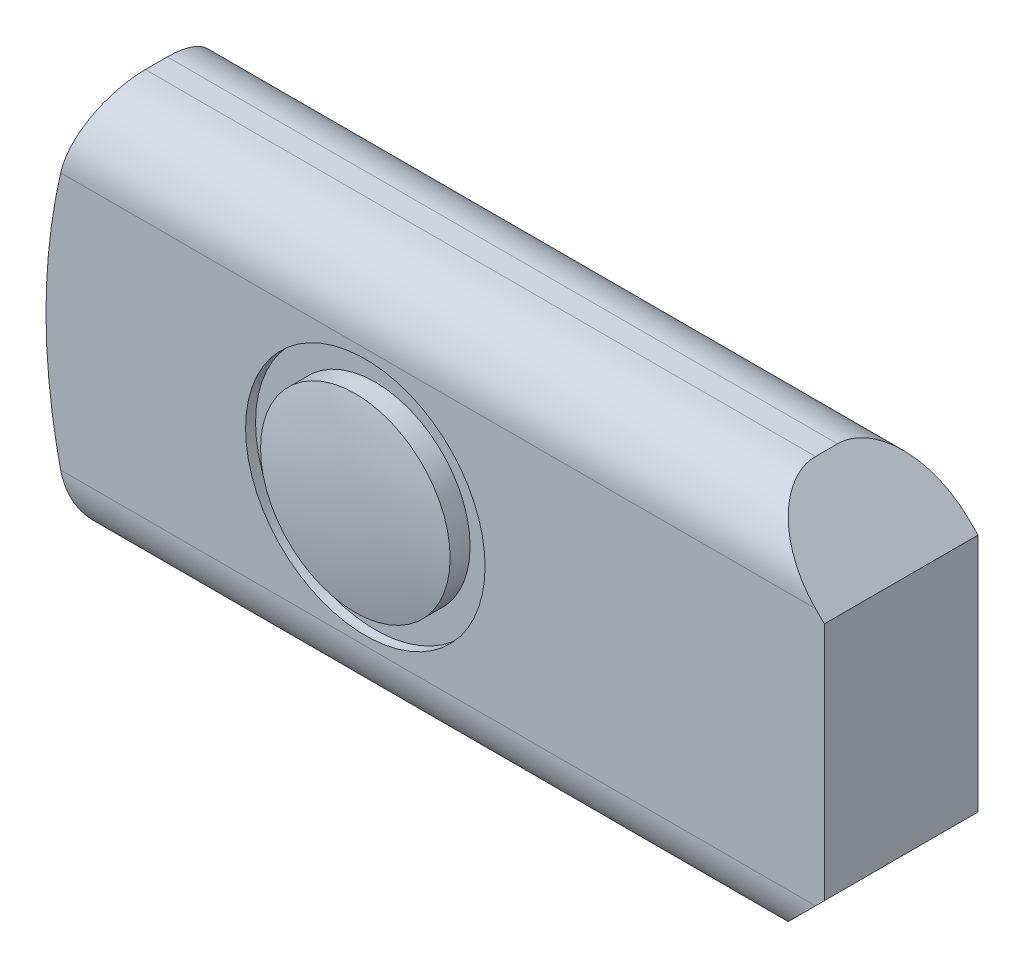
ISO-10303-21;
HEADER;
FILE_DESCRIPTION(('STEP AP214'),'2;1');
FILE_NAME('part.step','',(''),(''),'','','');
FILE_SCHEMA(('AUTOMOTIVE_DESIGN { 1 0 10303 214 1 1 1 1 }'));
ENDSEC;
DATA;
#1=APPLICATION_CONTEXT('core data for automotive mechanical design processes');
#2=APPLICATION_PROTOCOL_DEFINITION('international standard','automotive_design',2000,#1);
#3=PRODUCT_CONTEXT('',#1,'mechanical');
#4=PRODUCT('Part','Part','',(#3));
#5=PRODUCT_RELATED_PRODUCT_CATEGORY('part','',(#4));
#6=PRODUCT_DEFINITION_FORMATION('','',#4);
#7=PRODUCT_DEFINITION_CONTEXT('part definition',#1,'design');
#8=PRODUCT_DEFINITION('design','',#6,#7);
#9=PRODUCT_DEFINITION_SHAPE('','',#8);
#10=(LENGTH_UNIT() NAMED_UNIT(*) SI_UNIT(.MILLI.,.METRE.));
#11=(NAMED_UNIT(*) PLANE_ANGLE_UNIT() SI_UNIT($,.RADIAN.));
#12=(NAMED_UNIT(*) SI_UNIT($,.STERADIAN.) SOLID_ANGLE_UNIT());
#13=UNCERTAINTY_MEASURE_WITH_UNIT(LENGTH_MEASURE(1.E-05),#10,'distance_accuracy_value','');
#14=(GEOMETRIC_REPRESENTATION_CONTEXT(3) GLOBAL_UNCERTAINTY_ASSIGNED_CONTEXT((#13)) GLOBAL_UNIT_ASSIGNED_CONTEXT((#10,
#11,#12)) REPRESENTATION_CONTEXT('',''));
#15=CARTESIAN_POINT('',(0.,0.,0.));
#16=DIRECTION('',(0.,0.,1.));
#17=DIRECTION('',(1.,0.,0.));
#18=AXIS2_PLACEMENT_3D('',#15,#16,#17);
#19=CARTESIAN_POINT('',(1.67860547889594,0.,7.7));
#20=DIRECTION('',(0.,1.,0.));
#21=DIRECTION('',(0.,0.,1.));
#22=AXIS2_PLACEMENT_3D('',#19,#20,#21);
#23=PLANE('',#22);
#24=DIRECTION('',(0.,0.,-1.));
#25=VECTOR('',#24,1.);
#26=CARTESIAN_POINT('',(35.2581686598632,0.,14.5));
#27=LINE('',#26,#25);
#28=CARTESIAN_POINT('',(35.2581686598632,0.,4.4));
#29=VERTEX_POINT('',#28);
#30=CARTESIAN_POINT('',(35.2581686598632,0.,3.3));
#31=VERTEX_POINT('',#30);
#32=EDGE_CURVE('E61',#29,#31,#27,.T.);
#33=ORIENTED_EDGE('',*,*,#32,.F.);
#34=DIRECTION('',(1.,0.,0.));
#35=VECTOR('',#34,1.);
#36=CARTESIAN_POINT('',(1.67860547889594,0.,4.4));
#37=LINE('',#36,#35);
#38=CARTESIAN_POINT('',(1.67860547889594,0.,4.4));
#39=VERTEX_POINT('',#38);
#40=EDGE_CURVE('E200',#29,#39,#37,.F.);
#41=ORIENTED_EDGE('',*,*,#40,.T.);
#42=DIRECTION('',(0.,0.,-1.));
#43=VECTOR('',#42,1.);
#44=CARTESIAN_POINT('',(1.67860547889594,0.,7.7));
#45=LINE('',#44,#43);
#46=CARTESIAN_POINT('',(1.67860547889594,0.,3.3));
#47=VERTEX_POINT('',#46);
#48=EDGE_CURVE('E185',#39,#47,#45,.T.);
#49=ORIENTED_EDGE('',*,*,#48,.T.);
#50=DIRECTION('',(1.,0.,0.));
#51=VECTOR('',#50,1.);
#52=CARTESIAN_POINT('',(39.,0.,3.3));
#53=LINE('',#52,#51);
#54=EDGE_CURVE('E196',#47,#31,#53,.T.);
#55=ORIENTED_EDGE('',*,*,#54,.T.);
#56=EDGE_LOOP('',(#33,#41,#49,#55));
#57=FACE_BOUND('',#56,.T.);
#58=ADVANCED_FACE('F40',(#57),#23,.F.);
#59=CARTESIAN_POINT('',(39.,0.,7.7));
#60=DIRECTION('',(-1.,0.,0.));
#61=DIRECTION('',(0.,-1.,0.));
#62=AXIS2_PLACEMENT_3D('',#59,#60,#61);
#63=PLANE('',#62);
#64=DIRECTION('',(0.,0.,-1.));
#65=VECTOR('',#64,1.);
#66=CARTESIAN_POINT('',(39.,15.7581686598632,14.5));
#67=LINE('',#66,#65);
#68=CARTESIAN_POINT('',(39.,15.7581686598632,7.7));
#69=VERTEX_POINT('',#68);
#70=CARTESIAN_POINT('',(39.,15.7581686598632,0.));
#71=VERTEX_POINT('',#70);
#72=EDGE_CURVE('E137',#69,#71,#67,.T.);
#73=ORIENTED_EDGE('',*,*,#72,.F.);
#74=DIRECTION('',(0.,1.,0.));
#75=VECTOR('',#74,1.);
#76=CARTESIAN_POINT('',(39.,0.,7.7));
#77=LINE('',#76,#75);
#78=CARTESIAN_POINT('',(39.,3.74183134013686,7.7));
#79=VERTEX_POINT('',#78);
#80=EDGE_CURVE('E172',#79,#69,#77,.T.);
#81=ORIENTED_EDGE('',*,*,#80,.F.);
#82=DIRECTION('',(0.,0.,-1.));
#83=VECTOR('',#82,1.);
#84=CARTESIAN_POINT('',(39.,3.74183134013686,14.5));
#85=LINE('',#84,#83);
#86=CARTESIAN_POINT('',(39.,3.74183134013686,0.));
#87=VERTEX_POINT('',#86);
#88=EDGE_CURVE('E149',#79,#87,#85,.T.);
#89=ORIENTED_EDGE('',*,*,#88,.T.);
#90=DIRECTION('',(0.,1.,0.));
#91=VECTOR('',#90,1.);
#92=CARTESIAN_POINT('',(39.,0.,0.));
#93=LINE('',#92,#91);
#94=EDGE_CURVE('E156',#87,#71,#93,.T.);
#95=ORIENTED_EDGE('',*,*,#94,.T.);
#96=EDGE_LOOP('',(#73,#81,#89,#95));
#97=FACE_BOUND('',#96,.T.);
#98=ADVANCED_FACE('F164',(#97),#63,.F.);
#99=CARTESIAN_POINT('',(1.67860547889594,19.5,7.7));
#100=DIRECTION('',(0.,1.,0.));
#101=DIRECTION('',(0.,0.,1.));
#102=AXIS2_PLACEMENT_3D('',#99,#100,#101);
#103=PLANE('',#102);
#104=DIRECTION('',(1.,0.,0.));
#105=VECTOR('',#104,1.);
#106=CARTESIAN_POINT('',(39.,19.5,4.4));
#107=LINE('',#106,#105);
#108=CARTESIAN_POINT('',(1.67860547889594,19.5,4.4));
#109=VERTEX_POINT('',#108);
#110=CARTESIAN_POINT('',(35.2581686598632,19.5,4.4));
#111=VERTEX_POINT('',#110);
#112=EDGE_CURVE('E346',#109,#111,#107,.T.);
#113=ORIENTED_EDGE('',*,*,#112,.T.);
#114=DIRECTION('',(0.,0.,-1.));
#115=VECTOR('',#114,1.);
#116=CARTESIAN_POINT('',(35.2581686598632,19.5,14.5));
#117=LINE('',#116,#115);
#118=CARTESIAN_POINT('',(35.2581686598632,19.5,3.3));
#119=VERTEX_POINT('',#118);
#120=EDGE_CURVE('E71',#111,#119,#117,.T.);
#121=ORIENTED_EDGE('',*,*,#120,.T.);
#122=DIRECTION('',(1.,0.,0.));
#123=VECTOR('',#122,1.);
#124=CARTESIAN_POINT('',(1.67860547889594,19.5,3.3));
#125=LINE('',#124,#123);
#126=CARTESIAN_POINT('',(1.67860547889594,19.5,3.3));
#127=VERTEX_POINT('',#126);
#128=EDGE_CURVE('E349',#119,#127,#125,.F.);
#129=ORIENTED_EDGE('',*,*,#128,.T.);
#130=DIRECTION('',(0.,0.,-1.));
#131=VECTOR('',#130,1.);
#132=CARTESIAN_POINT('',(1.67860547889594,19.5,7.7));
#133=LINE('',#132,#131);
#134=EDGE_CURVE('E181',#109,#127,#133,.T.);
#135=ORIENTED_EDGE('',*,*,#134,.F.);
#136=EDGE_LOOP('',(#113,#121,#129,#135));
#137=FACE_BOUND('',#136,.T.);
#138=ADVANCED_FACE('F309',(#137),#103,.T.);
#139=CARTESIAN_POINT('',(0.,9.75,7.7));
#140=DIRECTION('',(0.,0.,-1.));
#141=DIRECTION('',(-1.,0.,0.));
#142=AXIS2_PLACEMENT_3D('',#139,#140,#141);
#143=PLANE('',#142);
#144=CARTESIAN_POINT('',(16.,9.75000000000001,7.7));
#145=DIRECTION('',(0.,0.,1.));
#146=DIRECTION('',(1.,0.,0.));
#147=AXIS2_PLACEMENT_3D('',#144,#145,#146);
#148=CIRCLE('',#147,6.);
#149=CARTESIAN_POINT('',(22.,9.75000000000001,7.7));
#150=VERTEX_POINT('',#149);
#151=EDGE_CURVE('E280',#150,#150,#148,.T.);
#152=ORIENTED_EDGE('',*,*,#151,.F.);
#153=EDGE_LOOP('',(#152));
#154=FACE_BOUND('',#153,.T.);
#155=DIRECTION('',(0.707106781186549,-0.707106781186546,0.));
#156=VECTOR('',#155,1.);
#157=CARTESIAN_POINT('',(22.5040843299315,32.2540843299316,7.7));
#158=LINE('',#157,#156);
#159=CARTESIAN_POINT('',(38.5581686598632,16.2,7.7));
#160=VERTEX_POINT('',#159);
#161=EDGE_CURVE('E143',#160,#69,#158,.T.);
#162=ORIENTED_EDGE('',*,*,#161,.F.);
#163=DIRECTION('',(1.,0.,0.));
#164=VECTOR('',#163,1.);
#165=CARTESIAN_POINT('',(1.67860547889594,16.2,7.7));
#166=LINE('',#165,#164);
#167=CARTESIAN_POINT('',(0.734613379994931,16.2,7.7));
#168=VERTEX_POINT('',#167);
#169=EDGE_CURVE('E189',#160,#168,#166,.F.);
#170=ORIENTED_EDGE('',*,*,#169,.T.);
#171=CARTESIAN_POINT('',(1.67860547889594,19.5,7.7));
#172=CARTESIAN_POINT('',(-1.67860547889594,9.75,7.7));
#173=CARTESIAN_POINT('',(1.67860547889594,0.,7.7));
#174=B_SPLINE_CURVE_WITH_KNOTS('',2,(#171,#172,#173),.UNSPECIFIED.,.F.,.F.,(3,3),(0.,1.),.UNSPECIFIED.);
#175=CARTESIAN_POINT('',(0.734613379994932,3.3,7.7));
#176=VERTEX_POINT('',#175);
#177=EDGE_CURVE('E166',#168,#176,#174,.T.);
#178=ORIENTED_EDGE('',*,*,#177,.T.);
#179=DIRECTION('',(1.,0.,0.));
#180=VECTOR('',#179,1.);
#181=CARTESIAN_POINT('',(0.,3.3,7.7));
#182=LINE('',#181,#180);
#183=CARTESIAN_POINT('',(38.5581686598631,3.3,7.7));
#184=VERTEX_POINT('',#183);
#185=EDGE_CURVE('E192',#176,#184,#182,.T.);
#186=ORIENTED_EDGE('',*,*,#185,.T.);
#187=DIRECTION('',(-0.707106781186546,-0.707106781186549,0.));
#188=VECTOR('',#187,1.);
#189=CARTESIAN_POINT('',(22.5040843299317,-12.7540843299316,7.7));
#190=LINE('',#189,#188);
#191=EDGE_CURVE('E175',#79,#184,#190,.T.);
#192=ORIENTED_EDGE('',*,*,#191,.F.);
#193=ORIENTED_EDGE('',*,*,#80,.T.);
#194=EDGE_LOOP('',(#162,#170,#178,#186,#192,#193));
#195=FACE_BOUND('',#194,.T.);
#196=ADVANCED_FACE('F243',(#154,#195),#143,.F.);
#197=CARTESIAN_POINT('',(0.,9.75,0.));
#198=DIRECTION('',(0.,0.,-1.));
#199=DIRECTION('',(-1.,0.,0.));
#200=AXIS2_PLACEMENT_3D('',#197,#198,#199);
#201=PLANE('',#200);
#202=CARTESIAN_POINT('',(16.,9.75000000000001,0.));
#203=DIRECTION('',(0.,0.,-1.));
#204=DIRECTION('',(-1.,0.,0.));
#205=AXIS2_PLACEMENT_3D('',#202,#203,#204);
#206=CIRCLE('',#205,6.);
#207=CARTESIAN_POINT('',(10.,9.75000000000001,0.));
#208=VERTEX_POINT('',#207);
#209=EDGE_CURVE('E266',#208,#208,#206,.T.);
#210=ORIENTED_EDGE('',*,*,#209,.F.);
#211=EDGE_LOOP('',(#210));
#212=FACE_BOUND('',#211,.T.);
#213=DIRECTION('',(1.,0.,0.));
#214=VECTOR('',#213,1.);
#215=CARTESIAN_POINT('',(0.,16.2,0.));
#216=LINE('',#215,#214);
#217=CARTESIAN_POINT('',(0.734613379994931,16.2,0.));
#218=VERTEX_POINT('',#217);
#219=CARTESIAN_POINT('',(38.5581686598632,16.2,0.));
#220=VERTEX_POINT('',#219);
#221=EDGE_CURVE('E159',#218,#220,#216,.T.);
#222=ORIENTED_EDGE('',*,*,#221,.T.);
#223=DIRECTION('',(0.707106781186549,-0.707106781186546,0.));
#224=VECTOR('',#223,1.);
#225=CARTESIAN_POINT('',(35.2581686598632,19.5,0.));
#226=LINE('',#225,#224);
#227=EDGE_CURVE('E140',#220,#71,#226,.T.);
#228=ORIENTED_EDGE('',*,*,#227,.T.);
#229=ORIENTED_EDGE('',*,*,#94,.F.);
#230=DIRECTION('',(-0.707106781186546,-0.707106781186549,0.));
#231=VECTOR('',#230,1.);
#232=CARTESIAN_POINT('',(39.,3.74183134013686,0.));
#233=LINE('',#232,#231);
#234=CARTESIAN_POINT('',(38.5581686598631,3.3,0.));
#235=VERTEX_POINT('',#234);
#236=EDGE_CURVE('E161',#87,#235,#233,.T.);
#237=ORIENTED_EDGE('',*,*,#236,.T.);
#238=DIRECTION('',(1.,0.,0.));
#239=VECTOR('',#238,1.);
#240=CARTESIAN_POINT('',(1.67860547889594,3.3,0.));
#241=LINE('',#240,#239);
#242=CARTESIAN_POINT('',(0.734613379994932,3.3,0.));
#243=VERTEX_POINT('',#242);
#244=EDGE_CURVE('E334',#235,#243,#241,.F.);
#245=ORIENTED_EDGE('',*,*,#244,.T.);
#246=CARTESIAN_POINT('',(1.67860547889594,19.5,0.));
#247=CARTESIAN_POINT('',(-1.67860547889594,9.75,0.));
#248=CARTESIAN_POINT('',(1.67860547889594,0.,0.));
#249=B_SPLINE_CURVE_WITH_KNOTS('',2,(#246,#247,#248),.UNSPECIFIED.,.F.,.F.,(3,3),(0.,1.),.UNSPECIFIED.);
#250=EDGE_CURVE('E167',#218,#243,#249,.T.);
#251=ORIENTED_EDGE('',*,*,#250,.F.);
#252=EDGE_LOOP('',(#222,#228,#229,#237,#245,#251));
#253=FACE_BOUND('',#252,.T.);
#254=ADVANCED_FACE('F154',(#212,#253),#201,.T.);
#255=CARTESIAN_POINT('',(0.,3.3,4.4));
#256=DIRECTION('',(1.,0.,0.));
#257=DIRECTION('',(0.,0.,-1.));
#258=AXIS2_PLACEMENT_3D('',#255,#256,#257);
#259=CYLINDRICAL_SURFACE('',#258,3.3);
#260=ORIENTED_EDGE('',*,*,#40,.F.);
#261=CARTESIAN_POINT('',(38.5581686598631,3.3,4.4));
#262=DIRECTION('',(0.707106781186549,-0.707106781186546,0.));
#263=DIRECTION('',(0.707106781186546,0.707106781186549,0.));
#264=AXIS2_PLACEMENT_3D('',#261,#262,#263);
#265=ELLIPSE('',#264,4.6669047558312,3.3);
#266=EDGE_CURVE('E248',#29,#184,#265,.F.);
#267=ORIENTED_EDGE('',*,*,#266,.T.);
#268=ORIENTED_EDGE('',*,*,#185,.F.);
#269=CARTESIAN_POINT('',(1.67860547889594,0.,4.4));
#270=CARTESIAN_POINT('',(1.67861236601289,-1.15102089664836E-05,4.4894932366842));
#271=CARTESIAN_POINT('',(1.67735210220116,0.00364026636792465,4.57898007595627));
#272=CARTESIAN_POINT('',(1.67234916106663,0.0181815712053499,4.7572773911837));
#273=CARTESIAN_POINT('',(1.66860695464756,0.0290697264946491,4.84608799221056));
#274=CARTESIAN_POINT('',(1.65870429294161,0.0579591086030109,5.02218474745448));
#275=CARTESIAN_POINT('',(1.65254986687802,0.0759426017145863,5.10947414005887));
#276=CARTESIAN_POINT('',(1.63792784297862,0.118836650802228,5.28211223095235));
#277=CARTESIAN_POINT('',(1.62946020714328,0.143747320572472,5.36746089733581));
#278=CARTESIAN_POINT('',(1.60077282744498,0.228553953225657,5.61967109087148));
#279=CARTESIAN_POINT('',(1.57725724490851,0.298557071076664,5.78289268290071));
#280=CARTESIAN_POINT('',(1.52281921618734,0.463086389529341,6.09502755105877));
#281=CARTESIAN_POINT('',(1.49189414271615,0.557621289697131,6.24393572557771));
#282=CARTESIAN_POINT('',(1.4233434614512,0.771234356283792,6.52784708892374));
#283=CARTESIAN_POINT('',(1.38555881002807,0.890908878144648,6.6623633454669));
#284=CARTESIAN_POINT('',(1.30576447196083,1.14973475427622,6.90966657160935));
#285=CARTESIAN_POINT('',(1.2637533862542,1.2888925640456,7.02244630957992));
#286=CARTESIAN_POINT('',(1.17529166603767,1.59018038119677,7.22867977236811));
#287=CARTESIAN_POINT('',(1.12872461873099,1.75309505235175,7.32093775157351));
#288=CARTESIAN_POINT('',(1.03504441405473,2.0919887944317,7.47659815908762));
#289=CARTESIAN_POINT('',(0.987931438640736,2.26796361247543,7.54000993328038));
#290=CARTESIAN_POINT('',(0.905752198212071,2.58665166619664,7.62516742652092));
#291=CARTESIAN_POINT('',(0.870416604655798,2.72766077422131,7.65315360874093));
#292=CARTESIAN_POINT('',(0.801236416115859,3.01234145643979,7.69057650244598));
#293=CARTESIAN_POINT('',(0.767390545534148,3.15601059702922,7.70002939776564));
#294=CARTESIAN_POINT('',(0.734613379994932,3.3,7.7));
#295=B_SPLINE_CURVE_WITH_KNOTS('',3,(#269,#270,#271,#272,#273,#274,#275,#276,#277,#278,#279,
#280,#281,#282,#283,#284,#285,#286,#287,#288,#289,#290,#291,#292,#293,#294),.UNSPECIFIED.,.F.,
.F.,(4,2,2,2,2,2,2,2,2,2,2,2,4),(0.,0.268385387177053,0.536719867640046,0.80438789304525,
1.07206031574876,1.60681604751258,2.14176167642397,2.69122252415698,3.24086586034557,
3.81704235353383,4.39303203807174,4.83599975475226,5.27858048584682),.UNSPECIFIED.);
#296=EDGE_CURVE('E328',#39,#176,#295,.T.);
#297=ORIENTED_EDGE('',*,*,#296,.F.);
#298=EDGE_LOOP('',(#260,#267,#268,#297));
#299=FACE_BOUND('',#298,.T.);
#300=ADVANCED_FACE('F226',(#299),#259,.T.);
#301=CARTESIAN_POINT('',(1.67860547889594,3.3,3.3));
#302=DIRECTION('',(-1.,0.,0.));
#303=DIRECTION('',(0.,0.,1.));
#304=AXIS2_PLACEMENT_3D('',#301,#302,#303);
#305=CYLINDRICAL_SURFACE('',#304,3.3);
#306=ORIENTED_EDGE('',*,*,#244,.F.);
#307=CARTESIAN_POINT('',(38.5581686598631,3.3,3.3));
#308=DIRECTION('',(0.707106781186549,-0.707106781186546,0.));
#309=DIRECTION('',(-0.707106781186546,-0.707106781186549,0.));
#310=AXIS2_PLACEMENT_3D('',#307,#308,#309);
#311=ELLIPSE('',#310,4.6669047558312,3.3);
#312=EDGE_CURVE('E11',#235,#31,#311,.F.);
#313=ORIENTED_EDGE('',*,*,#312,.T.);
#314=ORIENTED_EDGE('',*,*,#54,.F.);
#315=CARTESIAN_POINT('',(0.734613379994932,3.3,0.));
#316=CARTESIAN_POINT('',(0.756424679975927,3.20422657203799,-7.44893011294962E-06));
#317=CARTESIAN_POINT('',(0.778704674586168,3.1085691028685,0.00416925322647794));
#318=CARTESIAN_POINT('',(0.824006795875245,2.9181622936755,0.0207746168442393));
#319=CARTESIAN_POINT('',(0.847028828640956,2.82341284068637,0.0332022379319188));
#320=CARTESIAN_POINT('',(0.893610364866577,2.6355342950054,0.0661825323103927));
#321=CARTESIAN_POINT('',(0.91716951273166,2.54240419832045,0.0867299691244778));
#322=CARTESIAN_POINT('',(0.96461157336365,2.35836935415064,0.135760369540601));
#323=CARTESIAN_POINT('',(0.988494491025455,2.26746464036856,0.164243453244939));
#324=CARTESIAN_POINT('',(1.06029021653305,1.99899629165883,0.261328179938064));
#325=CARTESIAN_POINT('',(1.10838673626843,1.82553116030034,0.341591348140705));
#326=CARTESIAN_POINT('',(1.20287752905399,1.49478251443202,0.53096091295017));
#327=CARTESIAN_POINT('',(1.24927186964249,1.33749835745293,0.640066163761099));
#328=CARTESIAN_POINT('',(1.3382410486618,1.04317972007588,0.884766613769022));
#329=CARTESIAN_POINT('',(1.38081026703531,0.90617484984275,1.02039988963589));
#330=CARTESIAN_POINT('',(1.43993798900181,0.719483643507347,1.24081103495708));
#331=CARTESIAN_POINT('',(1.45886975659763,0.660358621140621,1.31716060039994));
#332=CARTESIAN_POINT('',(1.49488354077938,0.54885384002686,1.47503035409371));
#333=CARTESIAN_POINT('',(1.51196639033612,0.496471041757212,1.55654818747686));
#334=CARTESIAN_POINT('',(1.54350451004127,0.40046956207309,1.72153631418832));
#335=CARTESIAN_POINT('',(1.55802573600598,0.356626303384206,1.80486358936902));
#336=CARTESIAN_POINT('',(1.58484591449742,0.276123085932351,1.9752214911962));
#337=CARTESIAN_POINT('',(1.59714585463817,0.23945993418057,2.06225045065247));
#338=CARTESIAN_POINT('',(1.61931642079107,0.173678377447257,2.23932781757686));
#339=CARTESIAN_POINT('',(1.62918918347565,0.144553335379768,2.32937348946403));
#340=CARTESIAN_POINT('',(1.64634663450216,0.094107802784898,2.51182922711015));
#341=CARTESIAN_POINT('',(1.65363230856144,0.0727843396514178,2.60423837793228));
#342=CARTESIAN_POINT('',(1.66586707570853,0.0370466816372899,2.79670275169198));
#343=CARTESIAN_POINT('',(1.67063650902136,0.0231628359713431,2.896868461072));
#344=CARTESIAN_POINT('',(1.67700969898062,0.00463488448023108,3.09802235986962));
#345=CARTESIAN_POINT('',(1.67861742213349,-2.07985447236349E-05,3.19900935893867));
#346=CARTESIAN_POINT('',(1.67860547889594,0.,3.3));
#347=B_SPLINE_CURVE_WITH_KNOTS('',3,(#315,#316,#317,#318,#319,#320,#321,#322,#323,#324,#325,
#326,#327,#328,#329,#330,#331,#332,#333,#334,#335,#336,#337,#338,#339,#340,#341,#342,#343,#344,
#345,#346),.UNSPECIFIED.,.F.,.F.,(4,2,2,2,2,2,2,2,2,2,2,2,2,2,2,4),(0.,0.294572500743755,
0.589107865353454,0.883453593004431,1.17780377568215,1.76604782322791,2.35426850538912,
2.94333976217231,3.23823923349503,3.53300528937873,3.81846005900782,4.10378759739332,
4.38886305193412,4.67382977185225,4.97705845694606,5.27990648483299),.UNSPECIFIED.);
#348=EDGE_CURVE('E331',#243,#47,#347,.T.);
#349=ORIENTED_EDGE('',*,*,#348,.F.);
#350=EDGE_LOOP('',(#306,#313,#314,#349));
#351=FACE_BOUND('',#350,.T.);
#352=ADVANCED_FACE('F412',(#351),#305,.T.);
#353=CARTESIAN_POINT('',(0.,16.2,3.3));
#354=DIRECTION('',(1.,0.,0.));
#355=DIRECTION('',(0.,0.,-1.));
#356=AXIS2_PLACEMENT_3D('',#353,#354,#355);
#357=CYLINDRICAL_SURFACE('',#356,3.3);
#358=ORIENTED_EDGE('',*,*,#128,.F.);
#359=CARTESIAN_POINT('',(38.5581686598632,16.2,3.3));
#360=DIRECTION('',(0.707106781186546,0.707106781186549,0.));
#361=DIRECTION('',(0.707106781186549,-0.707106781186546,0.));
#362=AXIS2_PLACEMENT_3D('',#359,#360,#361);
#363=ELLIPSE('',#362,4.66690475583123,3.3);
#364=EDGE_CURVE('E251',#119,#220,#363,.F.);
#365=ORIENTED_EDGE('',*,*,#364,.T.);
#366=ORIENTED_EDGE('',*,*,#221,.F.);
#367=CARTESIAN_POINT('',(1.67860547889594,19.5,3.3));
#368=CARTESIAN_POINT('',(1.67861236601289,19.500011510209,3.2105067633158));
#369=CARTESIAN_POINT('',(1.67735210220116,19.4963597336321,3.12101992404373));
#370=CARTESIAN_POINT('',(1.67234916106663,19.4818184287947,2.9427226088163));
#371=CARTESIAN_POINT('',(1.66860695464756,19.4709302735053,2.85391200778945));
#372=CARTESIAN_POINT('',(1.65870429294161,19.442040891397,2.67781525254552));
#373=CARTESIAN_POINT('',(1.65254986687801,19.4240573982854,2.59052585994113));
#374=CARTESIAN_POINT('',(1.63792784297862,19.3811633491978,2.41788776904765));
#375=CARTESIAN_POINT('',(1.62946020714328,19.3562526794275,2.33253910266419));
#376=CARTESIAN_POINT('',(1.60077282744498,19.2714460467743,2.08032890912852));
#377=CARTESIAN_POINT('',(1.5772572449085,19.2014429289233,1.91710731709929));
#378=CARTESIAN_POINT('',(1.52281921618734,19.0369136104707,1.60497244894123));
#379=CARTESIAN_POINT('',(1.49189414271615,18.9423787103029,1.45606427442229));
#380=CARTESIAN_POINT('',(1.4233434614512,18.7287656437162,1.17215291107626));
#381=CARTESIAN_POINT('',(1.38555881002807,18.6090911218554,1.03763665453311));
#382=CARTESIAN_POINT('',(1.30576447196083,18.3502652457238,0.790333428390654));
#383=CARTESIAN_POINT('',(1.2637533862542,18.2111074359544,0.677553690420082));
#384=CARTESIAN_POINT('',(1.17529166603767,17.9098196188032,0.471320227631891));
#385=CARTESIAN_POINT('',(1.12872461873099,17.7469049476483,0.379062248426491));
#386=CARTESIAN_POINT('',(1.03504441405473,17.4080112055683,0.223401840912382));
#387=CARTESIAN_POINT('',(0.987931438640737,17.2320363875246,0.15999006671962));
#388=CARTESIAN_POINT('',(0.905752198212072,16.9133483338034,0.0748325734790787));
#389=CARTESIAN_POINT('',(0.870416604655799,16.7723392257787,0.0468463912590678));
#390=CARTESIAN_POINT('',(0.80123641611586,16.4876585435602,0.00942349755402609));
#391=CARTESIAN_POINT('',(0.767390545534149,16.3439894029708,-2.93977656414834E-05));
#392=CARTESIAN_POINT('',(0.734613379994933,16.2,0.));
#393=B_SPLINE_CURVE_WITH_KNOTS('',3,(#367,#368,#369,#370,#371,#372,#373,#374,#375,#376,#377,
#378,#379,#380,#381,#382,#383,#384,#385,#386,#387,#388,#389,#390,#391,#392),.UNSPECIFIED.,.F.,
.F.,(4,2,2,2,2,2,2,2,2,2,2,2,4),(0.,0.268385387177052,0.536719867640044,0.804387893045249,
1.07206031574876,1.60681604751258,2.14176167642397,2.69122252415698,3.24086586034557,
3.81704235353383,4.39303203807174,4.83599975475226,5.27858048584682),.UNSPECIFIED.);
#394=EDGE_CURVE('E211',#127,#218,#393,.T.);
#395=ORIENTED_EDGE('',*,*,#394,.F.);
#396=EDGE_LOOP('',(#358,#365,#366,#395));
#397=FACE_BOUND('',#396,.T.);
#398=ADVANCED_FACE('F498',(#397),#357,.T.);
#399=CARTESIAN_POINT('',(1.67860547889594,16.2,4.4));
#400=DIRECTION('',(-1.,0.,0.));
#401=DIRECTION('',(0.,0.,1.));
#402=AXIS2_PLACEMENT_3D('',#399,#400,#401);
#403=CYLINDRICAL_SURFACE('',#402,3.3);
#404=ORIENTED_EDGE('',*,*,#169,.F.);
#405=CARTESIAN_POINT('',(38.5581686598632,16.2,4.4));
#406=DIRECTION('',(0.707106781186546,0.707106781186549,0.));
#407=DIRECTION('',(-0.707106781186549,0.707106781186546,0.));
#408=AXIS2_PLACEMENT_3D('',#405,#406,#407);
#409=ELLIPSE('',#408,4.66690475583123,3.3);
#410=EDGE_CURVE('E50',#160,#111,#409,.F.);
#411=ORIENTED_EDGE('',*,*,#410,.T.);
#412=ORIENTED_EDGE('',*,*,#112,.F.);
#413=CARTESIAN_POINT('',(0.734613379994931,16.2,7.7));
#414=CARTESIAN_POINT('',(0.756424679975926,16.295773427962,7.70000744893011));
#415=CARTESIAN_POINT('',(0.778704674586168,16.3914308971315,7.69583074677352));
#416=CARTESIAN_POINT('',(0.824006795875245,16.5818377063245,7.67922538315576));
#417=CARTESIAN_POINT('',(0.847028828640956,16.6765871593136,7.66679776206808));
#418=CARTESIAN_POINT('',(0.893610364866577,16.8644657049946,7.6338174676896));
#419=CARTESIAN_POINT('',(0.91716951273166,16.9575958016795,7.61327003087552));
#420=CARTESIAN_POINT('',(0.96461157336365,17.1416306458494,7.5642396304594));
#421=CARTESIAN_POINT('',(0.988494491025455,17.2325353596314,7.53575654675506));
#422=CARTESIAN_POINT('',(1.06029021653305,17.5010037083412,7.43867182006194));
#423=CARTESIAN_POINT('',(1.10838673626843,17.6744688396997,7.35840865185929));
#424=CARTESIAN_POINT('',(1.20287752905399,18.005217485568,7.16903908704983));
#425=CARTESIAN_POINT('',(1.24927186964248,18.1625016425471,7.0599338362389));
#426=CARTESIAN_POINT('',(1.3382410486618,18.4568202799241,6.81523338623098));
#427=CARTESIAN_POINT('',(1.38081026703531,18.5938251501572,6.67960011036411));
#428=CARTESIAN_POINT('',(1.43993798900181,18.7805163564927,6.45918896504292));
#429=CARTESIAN_POINT('',(1.45886975659763,18.8396413788594,6.38283939960005));
#430=CARTESIAN_POINT('',(1.49488354077938,18.9511461599731,6.22496964590629));
#431=CARTESIAN_POINT('',(1.51196639033612,19.0035289582428,6.14345181252314));
#432=CARTESIAN_POINT('',(1.54350451004127,19.0995304379269,5.97846368581167));
#433=CARTESIAN_POINT('',(1.55802573600598,19.1433736966158,5.89513641063098));
#434=CARTESIAN_POINT('',(1.58484591449742,19.2238769140676,5.7247785088038));
#435=CARTESIAN_POINT('',(1.59714585463817,19.2605400658194,5.63774954934752));
#436=CARTESIAN_POINT('',(1.61931642079107,19.3263216225527,5.46067218242313));
#437=CARTESIAN_POINT('',(1.62918918347565,19.3554466646202,5.37062651053597));
#438=CARTESIAN_POINT('',(1.64634663450216,19.4058921972151,5.18817077288985));
#439=CARTESIAN_POINT('',(1.65363230856144,19.4272156603486,5.09576162206772));
#440=CARTESIAN_POINT('',(1.66586707570853,19.4629533183627,4.90329724830802));
#441=CARTESIAN_POINT('',(1.67063650902136,19.4768371640287,4.803131538928));
#442=CARTESIAN_POINT('',(1.67700969898062,19.4953651155198,4.60197764013038));
#443=CARTESIAN_POINT('',(1.67861742213349,19.5000207985447,4.50099064106133));
#444=CARTESIAN_POINT('',(1.67860547889594,19.5,4.4));
#445=B_SPLINE_CURVE_WITH_KNOTS('',3,(#413,#414,#415,#416,#417,#418,#419,#420,#421,#422,#423,
#424,#425,#426,#427,#428,#429,#430,#431,#432,#433,#434,#435,#436,#437,#438,#439,#440,#441,#442,
#443,#444),.UNSPECIFIED.,.F.,.F.,(4,2,2,2,2,2,2,2,2,2,2,2,2,2,2,4),(0.,0.294572500743757,
0.589107865353457,0.883453593004432,1.17780377568216,1.76604782322791,2.35426850538913,
2.94333976217231,3.23823923349503,3.53300528937874,3.81846005900782,4.10378759739333,
4.38886305193412,4.67382977185225,4.97705845694607,5.27990648483299),.UNSPECIFIED.);
#446=EDGE_CURVE('E203',#168,#109,#445,.T.);
#447=ORIENTED_EDGE('',*,*,#446,.F.);
#448=EDGE_LOOP('',(#404,#411,#412,#447));
#449=FACE_BOUND('',#448,.T.);
#450=ADVANCED_FACE('F217',(#449),#403,.T.);
#451=DIRECTION('',(0.,0.,-1.));
#452=VECTOR('',#451,1.);
#453=SURFACE_OF_LINEAR_EXTRUSION('',#174,#452);
#454=ORIENTED_EDGE('',*,*,#48,.F.);
#455=ORIENTED_EDGE('',*,*,#296,.T.);
#456=ORIENTED_EDGE('',*,*,#177,.F.);
#457=ORIENTED_EDGE('',*,*,#446,.T.);
#458=ORIENTED_EDGE('',*,*,#134,.T.);
#459=ORIENTED_EDGE('',*,*,#394,.T.);
#460=ORIENTED_EDGE('',*,*,#250,.T.);
#461=ORIENTED_EDGE('',*,*,#348,.T.);
#462=EDGE_LOOP('',(#454,#455,#456,#457,#458,#459,#460,#461));
#463=FACE_BOUND('',#462,.T.);
#464=ADVANCED_FACE('F219',(#463),#453,.F.);
#465=CARTESIAN_POINT('',(35.2581686598632,19.5,14.5));
#466=DIRECTION('',(0.707106781186546,0.707106781186549,0.));
#467=DIRECTION('',(-0.707106781186549,0.707106781186546,0.));
#468=AXIS2_PLACEMENT_3D('',#465,#466,#467);
#469=PLANE('',#468);
#470=ORIENTED_EDGE('',*,*,#120,.F.);
#471=ORIENTED_EDGE('',*,*,#410,.F.);
#472=ORIENTED_EDGE('',*,*,#161,.T.);
#473=ORIENTED_EDGE('',*,*,#72,.T.);
#474=ORIENTED_EDGE('',*,*,#227,.F.);
#475=ORIENTED_EDGE('',*,*,#364,.F.);
#476=EDGE_LOOP('',(#470,#471,#472,#473,#474,#475));
#477=FACE_BOUND('',#476,.T.);
#478=ADVANCED_FACE('F139',(#477),#469,.T.);
#479=CARTESIAN_POINT('',(39.,3.74183134013686,14.5));
#480=DIRECTION('',(0.707106781186549,-0.707106781186546,0.));
#481=DIRECTION('',(0.707106781186546,0.707106781186549,0.));
#482=AXIS2_PLACEMENT_3D('',#479,#480,#481);
#483=PLANE('',#482);
#484=ORIENTED_EDGE('',*,*,#191,.T.);
#485=ORIENTED_EDGE('',*,*,#266,.F.);
#486=ORIENTED_EDGE('',*,*,#32,.T.);
#487=ORIENTED_EDGE('',*,*,#312,.F.);
#488=ORIENTED_EDGE('',*,*,#236,.F.);
#489=ORIENTED_EDGE('',*,*,#88,.F.);
#490=EDGE_LOOP('',(#484,#485,#486,#487,#488,#489));
#491=FACE_BOUND('',#490,.T.);
#492=ADVANCED_FACE('F376',(#491),#483,.T.);
#493=CARTESIAN_POINT('',(16.,9.75000000000001,0.5));
#494=DIRECTION('',(0.,0.,-1.));
#495=DIRECTION('',(-1.,0.,0.));
#496=AXIS2_PLACEMENT_3D('',#493,#494,#495);
#497=CYLINDRICAL_SURFACE('',#496,6.);
#498=CARTESIAN_POINT('',(16.,9.75000000000001,0.5));
#499=DIRECTION('',(0.,0.,-1.));
#500=DIRECTION('',(-1.,0.,0.));
#501=AXIS2_PLACEMENT_3D('',#498,#499,#500);
#502=CIRCLE('',#501,6.);
#503=CARTESIAN_POINT('',(10.,9.75000000000001,0.5));
#504=VERTEX_POINT('',#503);
#505=EDGE_CURVE('E270',#504,#504,#502,.T.);
#506=ORIENTED_EDGE('',*,*,#505,.F.);
#507=EDGE_LOOP('',(#506));
#508=FACE_BOUND('',#507,.T.);
#509=ORIENTED_EDGE('',*,*,#209,.T.);
#510=EDGE_LOOP('',(#509));
#511=FACE_BOUND('',#510,.T.);
#512=ADVANCED_FACE('F370',(#508,#511),#497,.F.);
#513=CARTESIAN_POINT('',(16.,9.75000000000001,0.5));
#514=DIRECTION('',(0.,0.,-1.));
#515=DIRECTION('',(-1.,0.,0.));
#516=AXIS2_PLACEMENT_3D('',#513,#514,#515);
#517=PLANE('',#516);
#518=CARTESIAN_POINT('',(16.,9.75000000000001,0.5));
#519=DIRECTION('',(0.,0.,-1.));
#520=DIRECTION('',(-1.,0.,0.));
#521=AXIS2_PLACEMENT_3D('',#518,#519,#520);
#522=CIRCLE('',#521,4.75);
#523=CARTESIAN_POINT('',(11.25,9.75000000000001,0.5));
#524=VERTEX_POINT('',#523);
#525=EDGE_CURVE('E271',#524,#524,#522,.T.);
#526=ORIENTED_EDGE('',*,*,#525,.F.);
#527=EDGE_LOOP('',(#526));
#528=FACE_BOUND('',#527,.T.);
#529=ORIENTED_EDGE('',*,*,#505,.T.);
#530=EDGE_LOOP('',(#529));
#531=FACE_BOUND('',#530,.T.);
#532=ADVANCED_FACE('F364',(#528,#531),#517,.T.);
#533=CARTESIAN_POINT('',(16.,9.75000000000001,21.8125));
#534=DIRECTION('',(0.,0.,1.));
#535=DIRECTION('',(1.,0.,0.));
#536=AXIS2_PLACEMENT_3D('',#533,#534,#535);
#537=SPHERICAL_SURFACE('',#536,22.8125);
#538=CARTESIAN_POINT('',(16.,9.75000000000001,-0.499999999999999));
#539=DIRECTION('',(0.,0.,1.));
#540=DIRECTION('',(1.,0.,0.));
#541=AXIS2_PLACEMENT_3D('',#538,#539,#540);
#542=CIRCLE('',#541,4.75);
#543=CARTESIAN_POINT('',(20.75,9.75000000000001,-0.499999999999999));
#544=VERTEX_POINT('',#543);
#545=EDGE_CURVE('E44',#544,#544,#542,.T.);
#546=ORIENTED_EDGE('',*,*,#545,.F.);
#547=EDGE_LOOP('',(#546));
#548=FACE_BOUND('',#547,.T.);
#549=ADVANCED_FACE('F42',(#548),#537,.T.);
#550=CARTESIAN_POINT('',(16.,9.75000000000001,-0.499999999999999));
#551=DIRECTION('',(0.,0.,1.));
#552=DIRECTION('',(1.,0.,0.));
#553=AXIS2_PLACEMENT_3D('',#550,#551,#552);
#554=CYLINDRICAL_SURFACE('',#553,4.75);
#555=ORIENTED_EDGE('',*,*,#545,.T.);
#556=EDGE_LOOP('',(#555));
#557=FACE_BOUND('',#556,.T.);
#558=ORIENTED_EDGE('',*,*,#525,.T.);
#559=EDGE_LOOP('',(#558));
#560=FACE_BOUND('',#559,.T.);
#561=ADVANCED_FACE('F304',(#557,#560),#554,.T.);
#562=CARTESIAN_POINT('',(16.,9.75000000000001,7.2));
#563=DIRECTION('',(0.,0.,1.));
#564=DIRECTION('',(1.,0.,0.));
#565=AXIS2_PLACEMENT_3D('',#562,#563,#564);
#566=CYLINDRICAL_SURFACE('',#565,6.);
#567=CARTESIAN_POINT('',(16.,9.75000000000001,7.2));
#568=DIRECTION('',(0.,0.,1.));
#569=DIRECTION('',(1.,0.,0.));
#570=AXIS2_PLACEMENT_3D('',#567,#568,#569);
#571=CIRCLE('',#570,6.);
#572=CARTESIAN_POINT('',(22.,9.75000000000001,7.2));
#573=VERTEX_POINT('',#572);
#574=EDGE_CURVE('E279',#573,#573,#571,.T.);
#575=ORIENTED_EDGE('',*,*,#574,.F.);
#576=EDGE_LOOP('',(#575));
#577=FACE_BOUND('',#576,.T.);
#578=ORIENTED_EDGE('',*,*,#151,.T.);
#579=EDGE_LOOP('',(#578));
#580=FACE_BOUND('',#579,.T.);
#581=ADVANCED_FACE('F298',(#577,#580),#566,.F.);
#582=CARTESIAN_POINT('',(16.,9.75000000000001,7.2));
#583=DIRECTION('',(0.,0.,1.));
#584=DIRECTION('',(1.,0.,0.));
#585=AXIS2_PLACEMENT_3D('',#582,#583,#584);
#586=PLANE('',#585);
#587=CARTESIAN_POINT('',(16.,9.75000000000001,7.2));
#588=DIRECTION('',(0.,0.,1.));
#589=DIRECTION('',(1.,0.,0.));
#590=AXIS2_PLACEMENT_3D('',#587,#588,#589);
#591=CIRCLE('',#590,4.75);
#592=CARTESIAN_POINT('',(20.75,9.75000000000001,7.2));
#593=VERTEX_POINT('',#592);
#594=EDGE_CURVE('E284',#593,#593,#591,.T.);
#595=ORIENTED_EDGE('',*,*,#594,.F.);
#596=EDGE_LOOP('',(#595));
#597=FACE_BOUND('',#596,.T.);
#598=ORIENTED_EDGE('',*,*,#574,.T.);
#599=EDGE_LOOP('',(#598));
#600=FACE_BOUND('',#599,.T.);
#601=ADVANCED_FACE('F294',(#597,#600),#586,.T.);
#602=CARTESIAN_POINT('',(16.,9.75000000000001,-14.1125));
#603=DIRECTION('',(0.,0.,1.));
#604=DIRECTION('',(1.,0.,0.));
#605=AXIS2_PLACEMENT_3D('',#602,#603,#604);
#606=SPHERICAL_SURFACE('',#605,22.8125);
#607=CARTESIAN_POINT('',(16.,9.75000000000001,8.2));
#608=DIRECTION('',(0.,0.,1.));
#609=DIRECTION('',(1.,0.,0.));
#610=AXIS2_PLACEMENT_3D('',#607,#608,#609);
#611=CIRCLE('',#610,4.75);
#612=CARTESIAN_POINT('',(20.75,9.75000000000001,8.2));
#613=VERTEX_POINT('',#612);
#614=EDGE_CURVE('E275',#613,#613,#611,.T.);
#615=ORIENTED_EDGE('',*,*,#614,.T.);
#616=EDGE_LOOP('',(#615));
#617=FACE_BOUND('',#616,.T.);
#618=ADVANCED_FACE('F297',(#617),#606,.T.);
#619=ORIENTED_EDGE('',*,*,#614,.F.);
#620=EDGE_LOOP('',(#619));
#621=FACE_BOUND('',#620,.T.);
#622=ORIENTED_EDGE('',*,*,#594,.T.);
#623=EDGE_LOOP('',(#622));
#624=FACE_BOUND('',#623,.T.);
#625=ADVANCED_FACE('F292',(#621,#624),#554,.T.);
#626=CLOSED_SHELL('',(#58,#98,#138,#196,#254,#300,#352,#398,#450,#464,#478,#492,#512,#532,#549,
#561,#581,#601,#618,#625));
#627=MANIFOLD_SOLID_BREP('B2',#626);
#628=ADVANCED_BREP_SHAPE_REPRESENTATION('',(#18,#627),#14);
#629=SHAPE_DEFINITION_REPRESENTATION(#9,#628);
ENDSEC;
END-ISO-10303-21;
